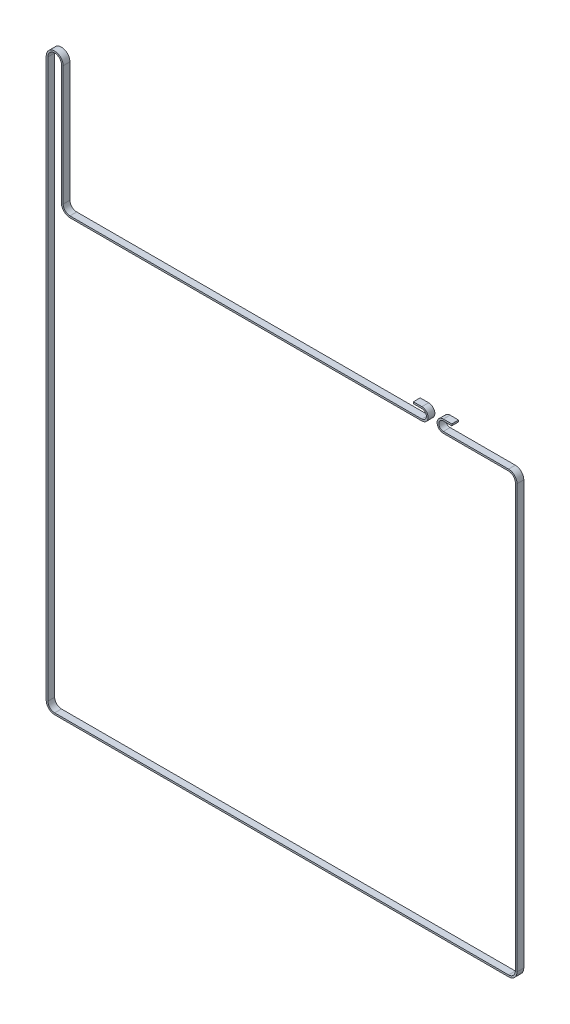
ISO-10303-21;
HEADER;
FILE_DESCRIPTION(('STEP AP214'),'2;1');
FILE_NAME('part.step','',(''),(''),'','','');
FILE_SCHEMA(('AUTOMOTIVE_DESIGN { 1 0 10303 214 1 1 1 1 }'));
ENDSEC;
DATA;
#1=APPLICATION_CONTEXT('core data for automotive mechanical design processes');
#2=APPLICATION_PROTOCOL_DEFINITION('international standard','automotive_design',2000,#1);
#3=PRODUCT_CONTEXT('',#1,'mechanical');
#4=PRODUCT('Part','Part','',(#3));
#5=PRODUCT_RELATED_PRODUCT_CATEGORY('part','',(#4));
#6=PRODUCT_DEFINITION_FORMATION('','',#4);
#7=PRODUCT_DEFINITION_CONTEXT('part definition',#1,'design');
#8=PRODUCT_DEFINITION('design','',#6,#7);
#9=PRODUCT_DEFINITION_SHAPE('','',#8);
#10=(LENGTH_UNIT() NAMED_UNIT(*) SI_UNIT(.MILLI.,.METRE.));
#11=(NAMED_UNIT(*) PLANE_ANGLE_UNIT() SI_UNIT($,.RADIAN.));
#12=(NAMED_UNIT(*) SI_UNIT($,.STERADIAN.) SOLID_ANGLE_UNIT());
#13=UNCERTAINTY_MEASURE_WITH_UNIT(LENGTH_MEASURE(1.E-05),#10,'distance_accuracy_value','');
#14=(GEOMETRIC_REPRESENTATION_CONTEXT(3) GLOBAL_UNCERTAINTY_ASSIGNED_CONTEXT((#13)) GLOBAL_UNIT_ASSIGNED_CONTEXT((#10,
#11,#12)) REPRESENTATION_CONTEXT('',''));
#15=CARTESIAN_POINT('',(0.,0.,0.));
#16=DIRECTION('',(0.,0.,1.));
#17=DIRECTION('',(1.,0.,0.));
#18=AXIS2_PLACEMENT_3D('',#15,#16,#17);
#19=CARTESIAN_POINT('',(317.727783268106,-102.649819195851,6.));
#20=DIRECTION('',(0.,-1.,0.));
#21=DIRECTION('',(1.,0.,0.));
#22=AXIS2_PLACEMENT_3D('',#19,#20,#21);
#23=PLANE('',#22);
#24=DIRECTION('',(-1.,0.,0.));
#25=VECTOR('',#24,1.);
#26=CARTESIAN_POINT('',(317.727783268106,-102.649819195851,0.));
#27=LINE('',#26,#25);
#28=CARTESIAN_POINT('',(325.227783268106,-102.649819195851,0.));
#29=VERTEX_POINT('',#28);
#30=CARTESIAN_POINT('',(317.727783268106,-102.649819195851,0.));
#31=VERTEX_POINT('',#30);
#32=EDGE_CURVE('E285',#29,#31,#27,.T.);
#33=ORIENTED_EDGE('',*,*,#32,.T.);
#34=DIRECTION('',(0.,0.,-1.));
#35=VECTOR('',#34,1.);
#36=CARTESIAN_POINT('',(317.727783268106,-102.649819195851,6.));
#37=LINE('',#36,#35);
#38=CARTESIAN_POINT('',(317.727783268106,-102.649819195851,6.));
#39=VERTEX_POINT('',#38);
#40=EDGE_CURVE('E13',#39,#31,#37,.T.);
#41=ORIENTED_EDGE('',*,*,#40,.F.);
#42=DIRECTION('',(-1.,0.,0.));
#43=VECTOR('',#42,1.);
#44=CARTESIAN_POINT('',(317.727783268106,-102.649819195851,6.));
#45=LINE('',#44,#43);
#46=CARTESIAN_POINT('',(325.227783268106,-102.649819195851,6.));
#47=VERTEX_POINT('',#46);
#48=EDGE_CURVE('E347',#47,#39,#45,.T.);
#49=ORIENTED_EDGE('',*,*,#48,.F.);
#50=DIRECTION('',(0.,0.,-1.));
#51=VECTOR('',#50,1.);
#52=CARTESIAN_POINT('',(325.227783268106,-102.649819195851,6.));
#53=LINE('',#52,#51);
#54=EDGE_CURVE('E281',#47,#29,#53,.T.);
#55=ORIENTED_EDGE('',*,*,#54,.T.);
#56=EDGE_LOOP('',(#33,#41,#49,#55));
#57=FACE_BOUND('',#56,.T.);
#58=ADVANCED_FACE('F45',(#57),#23,.F.);
#59=CARTESIAN_POINT('',(317.727783268106,-102.649819195851,6.));
#60=DIRECTION('',(1.,0.,0.));
#61=DIRECTION('',(0.,1.,0.));
#62=AXIS2_PLACEMENT_3D('',#59,#60,#61);
#63=PLANE('',#62);
#64=DIRECTION('',(0.,-1.,0.));
#65=VECTOR('',#64,1.);
#66=CARTESIAN_POINT('',(317.727783268106,-102.649819195851,0.));
#67=LINE('',#66,#65);
#68=CARTESIAN_POINT('',(317.727783268106,-104.149819195851,0.));
#69=VERTEX_POINT('',#68);
#70=EDGE_CURVE('E288',#31,#69,#67,.T.);
#71=ORIENTED_EDGE('',*,*,#70,.T.);
#72=DIRECTION('',(0.,0.,-1.));
#73=VECTOR('',#72,1.);
#74=CARTESIAN_POINT('',(317.727783268106,-104.149819195851,6.));
#75=LINE('',#74,#73);
#76=CARTESIAN_POINT('',(317.727783268106,-104.149819195851,6.));
#77=VERTEX_POINT('',#76);
#78=EDGE_CURVE('E53',#77,#69,#75,.T.);
#79=ORIENTED_EDGE('',*,*,#78,.F.);
#80=DIRECTION('',(0.,-1.,0.));
#81=VECTOR('',#80,1.);
#82=CARTESIAN_POINT('',(317.727783268106,-102.649819195851,6.));
#83=LINE('',#82,#81);
#84=EDGE_CURVE('E176',#39,#77,#83,.T.);
#85=ORIENTED_EDGE('',*,*,#84,.F.);
#86=ORIENTED_EDGE('',*,*,#40,.T.);
#87=EDGE_LOOP('',(#71,#79,#85,#86));
#88=FACE_BOUND('',#87,.T.);
#89=ADVANCED_FACE('F525',(#88),#63,.F.);
#90=CARTESIAN_POINT('',(317.727783268106,-104.149819195851,6.));
#91=DIRECTION('',(0.,1.,0.));
#92=DIRECTION('',(-1.,0.,0.));
#93=AXIS2_PLACEMENT_3D('',#90,#91,#92);
#94=PLANE('',#93);
#95=DIRECTION('',(1.,0.,0.));
#96=VECTOR('',#95,1.);
#97=CARTESIAN_POINT('',(317.727783268106,-104.149819195851,0.));
#98=LINE('',#97,#96);
#99=CARTESIAN_POINT('',(325.227783268106,-104.149819195851,0.));
#100=VERTEX_POINT('',#99);
#101=EDGE_CURVE('E290',#69,#100,#98,.T.);
#102=ORIENTED_EDGE('',*,*,#101,.T.);
#103=DIRECTION('',(0.,0.,-1.));
#104=VECTOR('',#103,1.);
#105=CARTESIAN_POINT('',(325.227783268106,-104.149819195851,6.));
#106=LINE('',#105,#104);
#107=CARTESIAN_POINT('',(325.227783268106,-104.149819195851,6.));
#108=VERTEX_POINT('',#107);
#109=EDGE_CURVE('E426',#108,#100,#106,.T.);
#110=ORIENTED_EDGE('',*,*,#109,.F.);
#111=DIRECTION('',(1.,0.,0.));
#112=VECTOR('',#111,1.);
#113=CARTESIAN_POINT('',(317.727783268106,-104.149819195851,6.));
#114=LINE('',#113,#112);
#115=EDGE_CURVE('E434',#77,#108,#114,.T.);
#116=ORIENTED_EDGE('',*,*,#115,.F.);
#117=ORIENTED_EDGE('',*,*,#78,.T.);
#118=EDGE_LOOP('',(#102,#110,#116,#117));
#119=FACE_BOUND('',#118,.T.);
#120=ADVANCED_FACE('F432',(#119),#94,.F.);
#121=CARTESIAN_POINT('',(325.227783268106,-108.14981919585,6.));
#122=DIRECTION('',(0.,0.,-1.));
#123=DIRECTION('',(-1.,0.,0.));
#124=AXIS2_PLACEMENT_3D('',#121,#122,#123);
#125=CYLINDRICAL_SURFACE('',#124,3.99999999999925);
#126=CARTESIAN_POINT('',(325.227783268106,-108.14981919585,0.));
#127=DIRECTION('',(0.,0.,-1.));
#128=DIRECTION('',(-1.,0.,0.));
#129=AXIS2_PLACEMENT_3D('',#126,#127,#128);
#130=CIRCLE('',#129,3.99999999999925);
#131=CARTESIAN_POINT('',(325.227783268106,-112.149819195849,0.));
#132=VERTEX_POINT('',#131);
#133=EDGE_CURVE('E292',#100,#132,#130,.T.);
#134=ORIENTED_EDGE('',*,*,#133,.T.);
#135=DIRECTION('',(0.,0.,-1.));
#136=VECTOR('',#135,1.);
#137=CARTESIAN_POINT('',(325.227783268106,-112.149819195849,6.));
#138=LINE('',#137,#136);
#139=CARTESIAN_POINT('',(325.227783268106,-112.149819195849,6.));
#140=VERTEX_POINT('',#139);
#141=EDGE_CURVE('E423',#140,#132,#138,.T.);
#142=ORIENTED_EDGE('',*,*,#141,.F.);
#143=CARTESIAN_POINT('',(325.227783268106,-108.14981919585,6.));
#144=DIRECTION('',(0.,0.,-1.));
#145=DIRECTION('',(-1.,0.,0.));
#146=AXIS2_PLACEMENT_3D('',#143,#144,#145);
#147=CIRCLE('',#146,3.99999999999925);
#148=EDGE_CURVE('E452',#108,#140,#147,.T.);
#149=ORIENTED_EDGE('',*,*,#148,.F.);
#150=ORIENTED_EDGE('',*,*,#109,.T.);
#151=EDGE_LOOP('',(#134,#142,#149,#150));
#152=FACE_BOUND('',#151,.T.);
#153=ADVANCED_FACE('F443',(#152),#125,.F.);
#154=CARTESIAN_POINT('',(13.4999999999877,-112.149819195849,6.));
#155=DIRECTION('',(0.,-1.,0.));
#156=DIRECTION('',(1.,0.,0.));
#157=AXIS2_PLACEMENT_3D('',#154,#155,#156);
#158=PLANE('',#157);
#159=DIRECTION('',(-1.,0.,0.));
#160=VECTOR('',#159,1.);
#161=CARTESIAN_POINT('',(13.4999999999877,-112.149819195849,0.));
#162=LINE('',#161,#160);
#163=CARTESIAN_POINT('',(13.4999999999877,-112.149819195849,0.));
#164=VERTEX_POINT('',#163);
#165=EDGE_CURVE('E294',#132,#164,#162,.T.);
#166=ORIENTED_EDGE('',*,*,#165,.T.);
#167=DIRECTION('',(0.,0.,-1.));
#168=VECTOR('',#167,1.);
#169=CARTESIAN_POINT('',(13.4999999999877,-112.149819195849,6.));
#170=LINE('',#169,#168);
#171=CARTESIAN_POINT('',(13.4999999999877,-112.149819195849,6.));
#172=VERTEX_POINT('',#171);
#173=EDGE_CURVE('E420',#172,#164,#170,.T.);
#174=ORIENTED_EDGE('',*,*,#173,.F.);
#175=DIRECTION('',(-1.,0.,0.));
#176=VECTOR('',#175,1.);
#177=CARTESIAN_POINT('',(13.4999999999877,-112.149819195849,6.));
#178=LINE('',#177,#176);
#179=EDGE_CURVE('E449',#140,#172,#178,.T.);
#180=ORIENTED_EDGE('',*,*,#179,.F.);
#181=ORIENTED_EDGE('',*,*,#141,.T.);
#182=EDGE_LOOP('',(#166,#174,#180,#181));
#183=FACE_BOUND('',#182,.T.);
#184=ADVANCED_FACE('F447',(#183),#158,.F.);
#185=CARTESIAN_POINT('',(13.4999999999877,-106.149819195849,6.));
#186=DIRECTION('',(0.,0.,-1.));
#187=DIRECTION('',(-1.,0.,0.));
#188=AXIS2_PLACEMENT_3D('',#185,#186,#187);
#189=CYLINDRICAL_SURFACE('',#188,6.);
#190=CARTESIAN_POINT('',(13.4999999999877,-106.149819195849,0.));
#191=DIRECTION('',(0.,0.,-1.));
#192=DIRECTION('',(1.,0.,0.));
#193=AXIS2_PLACEMENT_3D('',#190,#191,#192);
#194=CIRCLE('',#193,6.);
#195=CARTESIAN_POINT('',(7.49999999998772,-106.14981919585,0.));
#196=VERTEX_POINT('',#195);
#197=EDGE_CURVE('E296',#164,#196,#194,.T.);
#198=ORIENTED_EDGE('',*,*,#197,.T.);
#199=DIRECTION('',(0.,0.,-1.));
#200=VECTOR('',#199,1.);
#201=CARTESIAN_POINT('',(7.49999999998772,-106.14981919585,6.));
#202=LINE('',#201,#200);
#203=CARTESIAN_POINT('',(7.49999999998772,-106.14981919585,6.));
#204=VERTEX_POINT('',#203);
#205=EDGE_CURVE('E417',#204,#196,#202,.T.);
#206=ORIENTED_EDGE('',*,*,#205,.F.);
#207=CARTESIAN_POINT('',(13.4999999999877,-106.149819195849,6.));
#208=DIRECTION('',(0.,0.,-1.));
#209=DIRECTION('',(1.,0.,0.));
#210=AXIS2_PLACEMENT_3D('',#207,#208,#209);
#211=CIRCLE('',#210,6.);
#212=EDGE_CURVE('E451',#172,#204,#211,.T.);
#213=ORIENTED_EDGE('',*,*,#212,.F.);
#214=ORIENTED_EDGE('',*,*,#173,.T.);
#215=EDGE_LOOP('',(#198,#206,#213,#214));
#216=FACE_BOUND('',#215,.T.);
#217=ADVANCED_FACE('F538',(#216),#189,.F.);
#218=CARTESIAN_POINT('',(7.49999999997407,7.72076846855246E-13,6.));
#219=DIRECTION('',(-1.,-1.28637768246761E-13,0.));
#220=DIRECTION('',(1.28637768246761E-13,-1.,0.));
#221=AXIS2_PLACEMENT_3D('',#218,#219,#220);
#222=PLANE('',#221);
#223=DIRECTION('',(-1.28637768246761E-13,1.,0.));
#224=VECTOR('',#223,1.);
#225=CARTESIAN_POINT('',(7.49999999997407,7.72076846855246E-13,0.));
#226=LINE('',#225,#224);
#227=CARTESIAN_POINT('',(7.49999999997407,7.72076846855246E-13,0.));
#228=VERTEX_POINT('',#227);
#229=EDGE_CURVE('E298',#196,#228,#226,.T.);
#230=ORIENTED_EDGE('',*,*,#229,.T.);
#231=DIRECTION('',(0.,0.,-1.));
#232=VECTOR('',#231,1.);
#233=CARTESIAN_POINT('',(7.49999999997407,7.72076846855246E-13,6.));
#234=LINE('',#233,#232);
#235=CARTESIAN_POINT('',(7.49999999997407,7.72076846855246E-13,6.));
#236=VERTEX_POINT('',#235);
#237=EDGE_CURVE('E414',#236,#228,#234,.T.);
#238=ORIENTED_EDGE('',*,*,#237,.F.);
#239=DIRECTION('',(-1.28637768246761E-13,1.,0.));
#240=VECTOR('',#239,1.);
#241=CARTESIAN_POINT('',(7.49999999997407,7.72076846855246E-13,6.));
#242=LINE('',#241,#240);
#243=EDGE_CURVE('E454',#204,#236,#242,.T.);
#244=ORIENTED_EDGE('',*,*,#243,.F.);
#245=ORIENTED_EDGE('',*,*,#205,.T.);
#246=EDGE_LOOP('',(#230,#238,#244,#245));
#247=FACE_BOUND('',#246,.T.);
#248=ADVANCED_FACE('F541',(#247),#222,.F.);
#249=CARTESIAN_POINT('',(0.,0.,6.));
#250=DIRECTION('',(0.,0.,-1.));
#251=DIRECTION('',(-1.,0.,0.));
#252=AXIS2_PLACEMENT_3D('',#249,#250,#251);
#253=CYLINDRICAL_SURFACE('',#252,7.49999999997408);
#254=CARTESIAN_POINT('',(0.,0.,0.));
#255=DIRECTION('',(0.,0.,1.));
#256=DIRECTION('',(1.,0.,0.));
#257=AXIS2_PLACEMENT_3D('',#254,#255,#256);
#258=CIRCLE('',#257,7.49999999997408);
#259=CARTESIAN_POINT('',(-7.49999999997408,0.,0.));
#260=VERTEX_POINT('',#259);
#261=EDGE_CURVE('E300',#228,#260,#258,.T.);
#262=ORIENTED_EDGE('',*,*,#261,.T.);
#263=DIRECTION('',(0.,0.,-1.));
#264=VECTOR('',#263,1.);
#265=CARTESIAN_POINT('',(-7.49999999997408,0.,6.));
#266=LINE('',#265,#264);
#267=CARTESIAN_POINT('',(-7.49999999997408,0.,6.));
#268=VERTEX_POINT('',#267);
#269=EDGE_CURVE('E411',#268,#260,#266,.T.);
#270=ORIENTED_EDGE('',*,*,#269,.F.);
#271=CARTESIAN_POINT('',(0.,0.,6.));
#272=DIRECTION('',(0.,0.,1.));
#273=DIRECTION('',(1.,0.,0.));
#274=AXIS2_PLACEMENT_3D('',#271,#272,#273);
#275=CIRCLE('',#274,7.49999999997408);
#276=EDGE_CURVE('E460',#236,#268,#275,.T.);
#277=ORIENTED_EDGE('',*,*,#276,.F.);
#278=ORIENTED_EDGE('',*,*,#237,.T.);
#279=EDGE_LOOP('',(#262,#270,#277,#278));
#280=FACE_BOUND('',#279,.T.);
#281=ADVANCED_FACE('F545',(#280),#253,.T.);
#282=CARTESIAN_POINT('',(-7.49999999997409,0.,6.));
#283=DIRECTION('',(1.,0.,0.));
#284=DIRECTION('',(0.,1.,0.));
#285=AXIS2_PLACEMENT_3D('',#282,#283,#284);
#286=PLANE('',#285);
#287=DIRECTION('',(0.,-1.,0.));
#288=VECTOR('',#287,1.);
#289=CARTESIAN_POINT('',(-7.49999999997409,0.,0.));
#290=LINE('',#289,#288);
#291=CARTESIAN_POINT('',(-7.49999999997403,-494.149999999999,0.));
#292=VERTEX_POINT('',#291);
#293=EDGE_CURVE('E302',#260,#292,#290,.T.);
#294=ORIENTED_EDGE('',*,*,#293,.T.);
#295=DIRECTION('',(0.,0.,-1.));
#296=VECTOR('',#295,1.);
#297=CARTESIAN_POINT('',(-7.49999999997403,-494.149999999999,6.));
#298=LINE('',#297,#296);
#299=CARTESIAN_POINT('',(-7.49999999997403,-494.149999999999,6.));
#300=VERTEX_POINT('',#299);
#301=EDGE_CURVE('E408',#300,#292,#298,.T.);
#302=ORIENTED_EDGE('',*,*,#301,.F.);
#303=DIRECTION('',(0.,-1.,0.));
#304=VECTOR('',#303,1.);
#305=CARTESIAN_POINT('',(-7.49999999997409,0.,6.));
#306=LINE('',#305,#304);
#307=EDGE_CURVE('E462',#268,#300,#306,.T.);
#308=ORIENTED_EDGE('',*,*,#307,.F.);
#309=ORIENTED_EDGE('',*,*,#269,.T.);
#310=EDGE_LOOP('',(#294,#302,#308,#309));
#311=FACE_BOUND('',#310,.T.);
#312=ADVANCED_FACE('F549',(#311),#286,.F.);
#313=CARTESIAN_POINT('',(4.16175564765313E-12,-494.149999999999,6.));
#314=DIRECTION('',(0.,0.,-1.));
#315=DIRECTION('',(-1.,0.,0.));
#316=AXIS2_PLACEMENT_3D('',#313,#314,#315);
#317=CYLINDRICAL_SURFACE('',#316,7.49999999997819);
#318=CARTESIAN_POINT('',(4.16175564765313E-12,-494.149999999999,0.));
#319=DIRECTION('',(0.,0.,1.));
#320=DIRECTION('',(1.,0.,0.));
#321=AXIS2_PLACEMENT_3D('',#318,#319,#320);
#322=CIRCLE('',#321,7.49999999997819);
#323=CARTESIAN_POINT('',(4.16037792000409E-12,-501.649999999978,0.));
#324=VERTEX_POINT('',#323);
#325=EDGE_CURVE('E304',#292,#324,#322,.T.);
#326=ORIENTED_EDGE('',*,*,#325,.T.);
#327=DIRECTION('',(0.,0.,-1.));
#328=VECTOR('',#327,1.);
#329=CARTESIAN_POINT('',(4.16037792000409E-12,-501.649999999978,6.));
#330=LINE('',#329,#328);
#331=CARTESIAN_POINT('',(4.16037792000409E-12,-501.649999999978,6.));
#332=VERTEX_POINT('',#331);
#333=EDGE_CURVE('E405',#332,#324,#330,.T.);
#334=ORIENTED_EDGE('',*,*,#333,.F.);
#335=CARTESIAN_POINT('',(4.16175564765313E-12,-494.149999999999,6.));
#336=DIRECTION('',(0.,0.,1.));
#337=DIRECTION('',(1.,0.,0.));
#338=AXIS2_PLACEMENT_3D('',#335,#336,#337);
#339=CIRCLE('',#338,7.49999999997819);
#340=EDGE_CURVE('E464',#300,#332,#339,.T.);
#341=ORIENTED_EDGE('',*,*,#340,.F.);
#342=ORIENTED_EDGE('',*,*,#301,.T.);
#343=EDGE_LOOP('',(#326,#334,#341,#342));
#344=FACE_BOUND('',#343,.T.);
#345=ADVANCED_FACE('F553',(#344),#317,.T.);
#346=CARTESIAN_POINT('',(4.16175564765313E-12,-501.649999999978,6.));
#347=DIRECTION('',(0.,1.,0.));
#348=DIRECTION('',(0.,0.,1.));
#349=AXIS2_PLACEMENT_3D('',#346,#347,#348);
#350=PLANE('',#349);
#351=DIRECTION('',(1.,0.,0.));
#352=VECTOR('',#351,1.);
#353=CARTESIAN_POINT('',(4.16175564765313E-12,-501.649999999978,0.));
#354=LINE('',#353,#352);
#355=CARTESIAN_POINT('',(401.999999999992,-501.649999999978,0.));
#356=VERTEX_POINT('',#355);
#357=EDGE_CURVE('E306',#324,#356,#354,.T.);
#358=ORIENTED_EDGE('',*,*,#357,.T.);
#359=DIRECTION('',(0.,0.,-1.));
#360=VECTOR('',#359,1.);
#361=CARTESIAN_POINT('',(401.999999999992,-501.649999999978,6.));
#362=LINE('',#361,#360);
#363=CARTESIAN_POINT('',(401.999999999992,-501.649999999978,6.));
#364=VERTEX_POINT('',#363);
#365=EDGE_CURVE('E402',#364,#356,#362,.T.);
#366=ORIENTED_EDGE('',*,*,#365,.F.);
#367=DIRECTION('',(1.,0.,0.));
#368=VECTOR('',#367,1.);
#369=CARTESIAN_POINT('',(4.16175564765313E-12,-501.649999999978,6.));
#370=LINE('',#369,#368);
#371=EDGE_CURVE('E466',#332,#364,#370,.T.);
#372=ORIENTED_EDGE('',*,*,#371,.F.);
#373=ORIENTED_EDGE('',*,*,#333,.T.);
#374=EDGE_LOOP('',(#358,#366,#372,#373));
#375=FACE_BOUND('',#374,.T.);
#376=ADVANCED_FACE('F557',(#375),#350,.F.);
#377=CARTESIAN_POINT('',(401.999999999992,-494.150000000003,6.));
#378=DIRECTION('',(0.,0.,-1.));
#379=DIRECTION('',(-1.,0.,0.));
#380=AXIS2_PLACEMENT_3D('',#377,#378,#379);
#381=CYLINDRICAL_SURFACE('',#380,7.49999999997447);
#382=CARTESIAN_POINT('',(401.999999999992,-494.150000000003,0.));
#383=DIRECTION('',(0.,0.,1.));
#384=DIRECTION('',(1.,0.,0.));
#385=AXIS2_PLACEMENT_3D('',#382,#383,#384);
#386=CIRCLE('',#385,7.49999999997447);
#387=CARTESIAN_POINT('',(409.499999999967,-494.150000000003,0.));
#388=VERTEX_POINT('',#387);
#389=EDGE_CURVE('E308',#356,#388,#386,.T.);
#390=ORIENTED_EDGE('',*,*,#389,.T.);
#391=DIRECTION('',(0.,0.,-1.));
#392=VECTOR('',#391,1.);
#393=CARTESIAN_POINT('',(409.499999999967,-494.150000000003,6.));
#394=LINE('',#393,#392);
#395=CARTESIAN_POINT('',(409.499999999967,-494.150000000003,6.));
#396=VERTEX_POINT('',#395);
#397=EDGE_CURVE('E399',#396,#388,#394,.T.);
#398=ORIENTED_EDGE('',*,*,#397,.F.);
#399=CARTESIAN_POINT('',(401.999999999992,-494.150000000003,6.));
#400=DIRECTION('',(0.,0.,1.));
#401=DIRECTION('',(1.,0.,0.));
#402=AXIS2_PLACEMENT_3D('',#399,#400,#401);
#403=CIRCLE('',#402,7.49999999997447);
#404=EDGE_CURVE('E468',#364,#396,#403,.T.);
#405=ORIENTED_EDGE('',*,*,#404,.F.);
#406=ORIENTED_EDGE('',*,*,#365,.T.);
#407=EDGE_LOOP('',(#390,#398,#405,#406));
#408=FACE_BOUND('',#407,.T.);
#409=ADVANCED_FACE('F561',(#408),#381,.T.);
#410=CARTESIAN_POINT('',(409.499999999967,-494.150000000003,6.));
#411=DIRECTION('',(-1.,0.,0.));
#412=DIRECTION('',(0.,-1.,0.));
#413=AXIS2_PLACEMENT_3D('',#410,#411,#412);
#414=PLANE('',#413);
#415=DIRECTION('',(0.,1.,0.));
#416=VECTOR('',#415,1.);
#417=CARTESIAN_POINT('',(409.499999999967,-494.150000000003,0.));
#418=LINE('',#417,#416);
#419=CARTESIAN_POINT('',(409.499999999967,-119.649819195821,0.));
#420=VERTEX_POINT('',#419);
#421=EDGE_CURVE('E310',#388,#420,#418,.T.);
#422=ORIENTED_EDGE('',*,*,#421,.T.);
#423=DIRECTION('',(0.,0.,-1.));
#424=VECTOR('',#423,1.);
#425=CARTESIAN_POINT('',(409.499999999967,-119.649819195821,6.));
#426=LINE('',#425,#424);
#427=CARTESIAN_POINT('',(409.499999999967,-119.649819195821,6.));
#428=VERTEX_POINT('',#427);
#429=EDGE_CURVE('E396',#428,#420,#426,.T.);
#430=ORIENTED_EDGE('',*,*,#429,.F.);
#431=DIRECTION('',(0.,1.,0.));
#432=VECTOR('',#431,1.);
#433=CARTESIAN_POINT('',(409.499999999967,-494.150000000003,6.));
#434=LINE('',#433,#432);
#435=EDGE_CURVE('E470',#396,#428,#434,.T.);
#436=ORIENTED_EDGE('',*,*,#435,.F.);
#437=ORIENTED_EDGE('',*,*,#397,.T.);
#438=EDGE_LOOP('',(#422,#430,#436,#437));
#439=FACE_BOUND('',#438,.T.);
#440=ADVANCED_FACE('F565',(#439),#414,.F.);
#441=CARTESIAN_POINT('',(401.999999999967,-119.649819195821,6.));
#442=DIRECTION('',(0.,0.,-1.));
#443=DIRECTION('',(-1.,0.,0.));
#444=AXIS2_PLACEMENT_3D('',#441,#442,#443);
#445=CYLINDRICAL_SURFACE('',#444,7.49999999999954);
#446=CARTESIAN_POINT('',(401.999999999967,-119.649819195821,0.));
#447=DIRECTION('',(0.,0.,1.));
#448=DIRECTION('',(1.,0.,0.));
#449=AXIS2_PLACEMENT_3D('',#446,#447,#448);
#450=CIRCLE('',#449,7.49999999999954);
#451=CARTESIAN_POINT('',(401.999999999967,-112.149819195821,0.));
#452=VERTEX_POINT('',#451);
#453=EDGE_CURVE('E312',#420,#452,#450,.T.);
#454=ORIENTED_EDGE('',*,*,#453,.T.);
#455=DIRECTION('',(0.,0.,-1.));
#456=VECTOR('',#455,1.);
#457=CARTESIAN_POINT('',(401.999999999967,-112.149819195821,6.));
#458=LINE('',#457,#456);
#459=CARTESIAN_POINT('',(401.999999999967,-112.149819195821,6.));
#460=VERTEX_POINT('',#459);
#461=EDGE_CURVE('E393',#460,#452,#458,.T.);
#462=ORIENTED_EDGE('',*,*,#461,.F.);
#463=CARTESIAN_POINT('',(401.999999999967,-119.649819195821,6.));
#464=DIRECTION('',(0.,0.,1.));
#465=DIRECTION('',(1.,0.,0.));
#466=AXIS2_PLACEMENT_3D('',#463,#464,#465);
#467=CIRCLE('',#466,7.49999999999954);
#468=EDGE_CURVE('E472',#428,#460,#467,.T.);
#469=ORIENTED_EDGE('',*,*,#468,.F.);
#470=ORIENTED_EDGE('',*,*,#429,.T.);
#471=EDGE_LOOP('',(#454,#462,#469,#470));
#472=FACE_BOUND('',#471,.T.);
#473=ADVANCED_FACE('F569',(#472),#445,.T.);
#474=CARTESIAN_POINT('',(401.999999999967,-112.149819195821,6.));
#475=DIRECTION('',(0.,-1.,0.));
#476=DIRECTION('',(1.,0.,0.));
#477=AXIS2_PLACEMENT_3D('',#474,#475,#476);
#478=PLANE('',#477);
#479=DIRECTION('',(-1.,0.,0.));
#480=VECTOR('',#479,1.);
#481=CARTESIAN_POINT('',(401.999999999967,-112.149819195821,0.));
#482=LINE('',#481,#480);
#483=CARTESIAN_POINT('',(344.227783268107,-112.149819195821,0.));
#484=VERTEX_POINT('',#483);
#485=EDGE_CURVE('E314',#452,#484,#482,.T.);
#486=ORIENTED_EDGE('',*,*,#485,.T.);
#487=DIRECTION('',(0.,0.,-1.));
#488=VECTOR('',#487,1.);
#489=CARTESIAN_POINT('',(344.227783268107,-112.149819195821,6.));
#490=LINE('',#489,#488);
#491=CARTESIAN_POINT('',(344.227783268107,-112.149819195821,6.));
#492=VERTEX_POINT('',#491);
#493=EDGE_CURVE('E390',#492,#484,#490,.T.);
#494=ORIENTED_EDGE('',*,*,#493,.F.);
#495=DIRECTION('',(-1.,0.,0.));
#496=VECTOR('',#495,1.);
#497=CARTESIAN_POINT('',(401.999999999967,-112.149819195821,6.));
#498=LINE('',#497,#496);
#499=EDGE_CURVE('E474',#460,#492,#498,.T.);
#500=ORIENTED_EDGE('',*,*,#499,.F.);
#501=ORIENTED_EDGE('',*,*,#461,.T.);
#502=EDGE_LOOP('',(#486,#494,#500,#501));
#503=FACE_BOUND('',#502,.T.);
#504=ADVANCED_FACE('F573',(#503),#478,.F.);
#505=CARTESIAN_POINT('',(344.227783268107,-108.149819195822,6.));
#506=DIRECTION('',(0.,0.,-1.));
#507=DIRECTION('',(-1.,0.,0.));
#508=AXIS2_PLACEMENT_3D('',#505,#506,#507);
#509=CYLINDRICAL_SURFACE('',#508,3.99999999999949);
#510=CARTESIAN_POINT('',(344.227783268107,-108.149819195822,0.));
#511=DIRECTION('',(0.,0.,-1.));
#512=DIRECTION('',(1.,0.,0.));
#513=AXIS2_PLACEMENT_3D('',#510,#511,#512);
#514=CIRCLE('',#513,3.99999999999949);
#515=CARTESIAN_POINT('',(344.227783268107,-104.149819195822,0.));
#516=VERTEX_POINT('',#515);
#517=EDGE_CURVE('E316',#484,#516,#514,.T.);
#518=ORIENTED_EDGE('',*,*,#517,.T.);
#519=DIRECTION('',(0.,0.,-1.));
#520=VECTOR('',#519,1.);
#521=CARTESIAN_POINT('',(344.227783268107,-104.149819195822,6.));
#522=LINE('',#521,#520);
#523=CARTESIAN_POINT('',(344.227783268107,-104.149819195822,6.));
#524=VERTEX_POINT('',#523);
#525=EDGE_CURVE('E387',#524,#516,#522,.T.);
#526=ORIENTED_EDGE('',*,*,#525,.F.);
#527=CARTESIAN_POINT('',(344.227783268107,-108.149819195822,6.));
#528=DIRECTION('',(0.,0.,-1.));
#529=DIRECTION('',(1.,0.,0.));
#530=AXIS2_PLACEMENT_3D('',#527,#528,#529);
#531=CIRCLE('',#530,3.99999999999949);
#532=EDGE_CURVE('E476',#492,#524,#531,.T.);
#533=ORIENTED_EDGE('',*,*,#532,.F.);
#534=ORIENTED_EDGE('',*,*,#493,.T.);
#535=EDGE_LOOP('',(#518,#526,#533,#534));
#536=FACE_BOUND('',#535,.T.);
#537=ADVANCED_FACE('F577',(#536),#509,.F.);
#538=CARTESIAN_POINT('',(351.727783268107,-104.149819195822,6.));
#539=DIRECTION('',(0.,1.,0.));
#540=DIRECTION('',(-1.,0.,0.));
#541=AXIS2_PLACEMENT_3D('',#538,#539,#540);
#542=PLANE('',#541);
#543=DIRECTION('',(1.,0.,0.));
#544=VECTOR('',#543,1.);
#545=CARTESIAN_POINT('',(351.727783268107,-104.149819195822,0.));
#546=LINE('',#545,#544);
#547=CARTESIAN_POINT('',(351.727783268107,-104.149819195822,0.));
#548=VERTEX_POINT('',#547);
#549=EDGE_CURVE('E318',#516,#548,#546,.T.);
#550=ORIENTED_EDGE('',*,*,#549,.T.);
#551=DIRECTION('',(0.,0.,-1.));
#552=VECTOR('',#551,1.);
#553=CARTESIAN_POINT('',(351.727783268107,-104.149819195822,6.));
#554=LINE('',#553,#552);
#555=CARTESIAN_POINT('',(351.727783268107,-104.149819195822,6.));
#556=VERTEX_POINT('',#555);
#557=EDGE_CURVE('E384',#556,#548,#554,.T.);
#558=ORIENTED_EDGE('',*,*,#557,.F.);
#559=DIRECTION('',(1.,0.,0.));
#560=VECTOR('',#559,1.);
#561=CARTESIAN_POINT('',(351.727783268107,-104.149819195822,6.));
#562=LINE('',#561,#560);
#563=EDGE_CURVE('E478',#524,#556,#562,.T.);
#564=ORIENTED_EDGE('',*,*,#563,.F.);
#565=ORIENTED_EDGE('',*,*,#525,.T.);
#566=EDGE_LOOP('',(#550,#558,#564,#565));
#567=FACE_BOUND('',#566,.T.);
#568=ADVANCED_FACE('F581',(#567),#542,.F.);
#569=CARTESIAN_POINT('',(351.727783268107,-102.649819195823,6.));
#570=DIRECTION('',(-1.,0.,0.));
#571=DIRECTION('',(0.,0.,1.));
#572=AXIS2_PLACEMENT_3D('',#569,#570,#571);
#573=PLANE('',#572);
#574=DIRECTION('',(0.,1.,0.));
#575=VECTOR('',#574,1.);
#576=CARTESIAN_POINT('',(351.727783268107,-102.649819195823,0.));
#577=LINE('',#576,#575);
#578=CARTESIAN_POINT('',(351.727783268107,-102.649819195823,0.));
#579=VERTEX_POINT('',#578);
#580=EDGE_CURVE('E320',#548,#579,#577,.T.);
#581=ORIENTED_EDGE('',*,*,#580,.T.);
#582=DIRECTION('',(0.,0.,-1.));
#583=VECTOR('',#582,1.);
#584=CARTESIAN_POINT('',(351.727783268107,-102.649819195823,6.));
#585=LINE('',#584,#583);
#586=CARTESIAN_POINT('',(351.727783268107,-102.649819195823,6.));
#587=VERTEX_POINT('',#586);
#588=EDGE_CURVE('E381',#587,#579,#585,.T.);
#589=ORIENTED_EDGE('',*,*,#588,.F.);
#590=DIRECTION('',(0.,1.,0.));
#591=VECTOR('',#590,1.);
#592=CARTESIAN_POINT('',(351.727783268107,-102.649819195823,6.));
#593=LINE('',#592,#591);
#594=EDGE_CURVE('E480',#556,#587,#593,.T.);
#595=ORIENTED_EDGE('',*,*,#594,.F.);
#596=ORIENTED_EDGE('',*,*,#557,.T.);
#597=EDGE_LOOP('',(#581,#589,#595,#596));
#598=FACE_BOUND('',#597,.T.);
#599=ADVANCED_FACE('F585',(#598),#573,.F.);
#600=CARTESIAN_POINT('',(351.727783268107,-102.649819195823,6.));
#601=DIRECTION('',(0.,-1.,0.));
#602=DIRECTION('',(0.,0.,-1.));
#603=AXIS2_PLACEMENT_3D('',#600,#601,#602);
#604=PLANE('',#603);
#605=DIRECTION('',(-1.,0.,0.));
#606=VECTOR('',#605,1.);
#607=CARTESIAN_POINT('',(351.727783268107,-102.649819195823,0.));
#608=LINE('',#607,#606);
#609=CARTESIAN_POINT('',(344.227783268107,-102.649819195823,0.));
#610=VERTEX_POINT('',#609);
#611=EDGE_CURVE('E322',#579,#610,#608,.T.);
#612=ORIENTED_EDGE('',*,*,#611,.T.);
#613=DIRECTION('',(0.,0.,-1.));
#614=VECTOR('',#613,1.);
#615=CARTESIAN_POINT('',(344.227783268107,-102.649819195823,6.));
#616=LINE('',#615,#614);
#617=CARTESIAN_POINT('',(344.227783268107,-102.649819195823,6.));
#618=VERTEX_POINT('',#617);
#619=EDGE_CURVE('E378',#618,#610,#616,.T.);
#620=ORIENTED_EDGE('',*,*,#619,.F.);
#621=DIRECTION('',(-1.,0.,0.));
#622=VECTOR('',#621,1.);
#623=CARTESIAN_POINT('',(351.727783268107,-102.649819195823,6.));
#624=LINE('',#623,#622);
#625=EDGE_CURVE('E482',#587,#618,#624,.T.);
#626=ORIENTED_EDGE('',*,*,#625,.F.);
#627=ORIENTED_EDGE('',*,*,#588,.T.);
#628=EDGE_LOOP('',(#612,#620,#626,#627));
#629=FACE_BOUND('',#628,.T.);
#630=ADVANCED_FACE('F589',(#629),#604,.F.);
#631=CARTESIAN_POINT('',(344.227783268107,-108.149819195822,6.));
#632=DIRECTION('',(0.,0.,-1.));
#633=DIRECTION('',(-1.,0.,0.));
#634=AXIS2_PLACEMENT_3D('',#631,#632,#633);
#635=CYLINDRICAL_SURFACE('',#634,5.49999999999898);
#636=CARTESIAN_POINT('',(344.227783268107,-108.149819195822,0.));
#637=DIRECTION('',(0.,0.,1.));
#638=DIRECTION('',(1.,0.,0.));
#639=AXIS2_PLACEMENT_3D('',#636,#637,#638);
#640=CIRCLE('',#639,5.49999999999898);
#641=CARTESIAN_POINT('',(344.227783268107,-113.649819195821,0.));
#642=VERTEX_POINT('',#641);
#643=EDGE_CURVE('E324',#610,#642,#640,.T.);
#644=ORIENTED_EDGE('',*,*,#643,.T.);
#645=DIRECTION('',(0.,0.,-1.));
#646=VECTOR('',#645,1.);
#647=CARTESIAN_POINT('',(344.227783268107,-113.649819195821,6.));
#648=LINE('',#647,#646);
#649=CARTESIAN_POINT('',(344.227783268107,-113.649819195821,6.));
#650=VERTEX_POINT('',#649);
#651=EDGE_CURVE('E375',#650,#642,#648,.T.);
#652=ORIENTED_EDGE('',*,*,#651,.F.);
#653=CARTESIAN_POINT('',(344.227783268107,-108.149819195822,6.));
#654=DIRECTION('',(0.,0.,1.));
#655=DIRECTION('',(1.,0.,0.));
#656=AXIS2_PLACEMENT_3D('',#653,#654,#655);
#657=CIRCLE('',#656,5.49999999999898);
#658=EDGE_CURVE('E484',#618,#650,#657,.T.);
#659=ORIENTED_EDGE('',*,*,#658,.F.);
#660=ORIENTED_EDGE('',*,*,#619,.T.);
#661=EDGE_LOOP('',(#644,#652,#659,#660));
#662=FACE_BOUND('',#661,.T.);
#663=ADVANCED_FACE('F593',(#662),#635,.T.);
#664=CARTESIAN_POINT('',(401.999999999967,-113.649819195821,6.));
#665=DIRECTION('',(0.,1.,0.));
#666=DIRECTION('',(0.,0.,1.));
#667=AXIS2_PLACEMENT_3D('',#664,#665,#666);
#668=PLANE('',#667);
#669=DIRECTION('',(1.,0.,0.));
#670=VECTOR('',#669,1.);
#671=CARTESIAN_POINT('',(401.999999999967,-113.649819195821,0.));
#672=LINE('',#671,#670);
#673=CARTESIAN_POINT('',(401.999999999967,-113.649819195821,0.));
#674=VERTEX_POINT('',#673);
#675=EDGE_CURVE('E326',#642,#674,#672,.T.);
#676=ORIENTED_EDGE('',*,*,#675,.T.);
#677=DIRECTION('',(0.,0.,-1.));
#678=VECTOR('',#677,1.);
#679=CARTESIAN_POINT('',(401.999999999967,-113.649819195821,6.));
#680=LINE('',#679,#678);
#681=CARTESIAN_POINT('',(401.999999999967,-113.649819195821,6.));
#682=VERTEX_POINT('',#681);
#683=EDGE_CURVE('E372',#682,#674,#680,.T.);
#684=ORIENTED_EDGE('',*,*,#683,.F.);
#685=DIRECTION('',(1.,0.,0.));
#686=VECTOR('',#685,1.);
#687=CARTESIAN_POINT('',(401.999999999967,-113.649819195821,6.));
#688=LINE('',#687,#686);
#689=EDGE_CURVE('E486',#650,#682,#688,.T.);
#690=ORIENTED_EDGE('',*,*,#689,.F.);
#691=ORIENTED_EDGE('',*,*,#651,.T.);
#692=EDGE_LOOP('',(#676,#684,#690,#691));
#693=FACE_BOUND('',#692,.T.);
#694=ADVANCED_FACE('F597',(#693),#668,.F.);
#695=CARTESIAN_POINT('',(401.999999999967,-119.649819195821,6.));
#696=DIRECTION('',(0.,0.,-1.));
#697=DIRECTION('',(-1.,0.,0.));
#698=AXIS2_PLACEMENT_3D('',#695,#696,#697);
#699=CYLINDRICAL_SURFACE('',#698,6.00000000000001);
#700=CARTESIAN_POINT('',(401.999999999967,-119.649819195821,0.));
#701=DIRECTION('',(0.,0.,-1.));
#702=DIRECTION('',(1.,0.,0.));
#703=AXIS2_PLACEMENT_3D('',#700,#701,#702);
#704=CIRCLE('',#703,6.00000000000001);
#705=CARTESIAN_POINT('',(407.999999999967,-119.649819195821,0.));
#706=VERTEX_POINT('',#705);
#707=EDGE_CURVE('E328',#674,#706,#704,.T.);
#708=ORIENTED_EDGE('',*,*,#707,.T.);
#709=DIRECTION('',(0.,0.,-1.));
#710=VECTOR('',#709,1.);
#711=CARTESIAN_POINT('',(407.999999999967,-119.649819195821,6.));
#712=LINE('',#711,#710);
#713=CARTESIAN_POINT('',(407.999999999967,-119.649819195821,6.));
#714=VERTEX_POINT('',#713);
#715=EDGE_CURVE('E369',#714,#706,#712,.T.);
#716=ORIENTED_EDGE('',*,*,#715,.F.);
#717=CARTESIAN_POINT('',(401.999999999967,-119.649819195821,6.));
#718=DIRECTION('',(0.,0.,-1.));
#719=DIRECTION('',(1.,0.,0.));
#720=AXIS2_PLACEMENT_3D('',#717,#718,#719);
#721=CIRCLE('',#720,6.00000000000001);
#722=EDGE_CURVE('E488',#682,#714,#721,.T.);
#723=ORIENTED_EDGE('',*,*,#722,.F.);
#724=ORIENTED_EDGE('',*,*,#683,.T.);
#725=EDGE_LOOP('',(#708,#716,#723,#724));
#726=FACE_BOUND('',#725,.T.);
#727=ADVANCED_FACE('F601',(#726),#699,.F.);
#728=CARTESIAN_POINT('',(407.999999999967,-494.150000000003,6.));
#729=DIRECTION('',(1.,0.,0.));
#730=DIRECTION('',(0.,0.,-1.));
#731=AXIS2_PLACEMENT_3D('',#728,#729,#730);
#732=PLANE('',#731);
#733=DIRECTION('',(0.,-1.,0.));
#734=VECTOR('',#733,1.);
#735=CARTESIAN_POINT('',(407.999999999967,-494.150000000003,0.));
#736=LINE('',#735,#734);
#737=CARTESIAN_POINT('',(407.999999999967,-494.150000000003,0.));
#738=VERTEX_POINT('',#737);
#739=EDGE_CURVE('E330',#706,#738,#736,.T.);
#740=ORIENTED_EDGE('',*,*,#739,.T.);
#741=DIRECTION('',(0.,0.,-1.));
#742=VECTOR('',#741,1.);
#743=CARTESIAN_POINT('',(407.999999999967,-494.150000000003,6.));
#744=LINE('',#743,#742);
#745=CARTESIAN_POINT('',(407.999999999967,-494.150000000003,6.));
#746=VERTEX_POINT('',#745);
#747=EDGE_CURVE('E366',#746,#738,#744,.T.);
#748=ORIENTED_EDGE('',*,*,#747,.F.);
#749=DIRECTION('',(0.,-1.,0.));
#750=VECTOR('',#749,1.);
#751=CARTESIAN_POINT('',(407.999999999967,-494.150000000003,6.));
#752=LINE('',#751,#750);
#753=EDGE_CURVE('E490',#714,#746,#752,.T.);
#754=ORIENTED_EDGE('',*,*,#753,.F.);
#755=ORIENTED_EDGE('',*,*,#715,.T.);
#756=EDGE_LOOP('',(#740,#748,#754,#755));
#757=FACE_BOUND('',#756,.T.);
#758=ADVANCED_FACE('F605',(#757),#732,.F.);
#759=CARTESIAN_POINT('',(401.999999999992,-494.150000000003,6.));
#760=DIRECTION('',(0.,0.,-1.));
#761=DIRECTION('',(-1.,0.,0.));
#762=AXIS2_PLACEMENT_3D('',#759,#760,#761);
#763=CYLINDRICAL_SURFACE('',#762,5.99999999998563);
#764=CARTESIAN_POINT('',(401.999999999992,-494.150000000003,0.));
#765=DIRECTION('',(0.,0.,-1.));
#766=DIRECTION('',(1.,0.,0.));
#767=AXIS2_PLACEMENT_3D('',#764,#765,#766);
#768=CIRCLE('',#767,5.99999999998563);
#769=CARTESIAN_POINT('',(401.999999999992,-500.149999999989,0.));
#770=VERTEX_POINT('',#769);
#771=EDGE_CURVE('E332',#738,#770,#768,.T.);
#772=ORIENTED_EDGE('',*,*,#771,.T.);
#773=DIRECTION('',(0.,0.,-1.));
#774=VECTOR('',#773,1.);
#775=CARTESIAN_POINT('',(401.999999999992,-500.149999999989,6.));
#776=LINE('',#775,#774);
#777=CARTESIAN_POINT('',(401.999999999992,-500.149999999989,6.));
#778=VERTEX_POINT('',#777);
#779=EDGE_CURVE('E363',#778,#770,#776,.T.);
#780=ORIENTED_EDGE('',*,*,#779,.F.);
#781=CARTESIAN_POINT('',(401.999999999992,-494.150000000003,6.));
#782=DIRECTION('',(0.,0.,-1.));
#783=DIRECTION('',(1.,0.,0.));
#784=AXIS2_PLACEMENT_3D('',#781,#782,#783);
#785=CIRCLE('',#784,5.99999999998563);
#786=EDGE_CURVE('E492',#746,#778,#785,.T.);
#787=ORIENTED_EDGE('',*,*,#786,.F.);
#788=ORIENTED_EDGE('',*,*,#747,.T.);
#789=EDGE_LOOP('',(#772,#780,#787,#788));
#790=FACE_BOUND('',#789,.T.);
#791=ADVANCED_FACE('F609',(#790),#763,.F.);
#792=CARTESIAN_POINT('',(4.16175564765313E-12,-500.149999999999,6.));
#793=DIRECTION('',(0.,-1.,0.));
#794=DIRECTION('',(1.,0.,0.));
#795=AXIS2_PLACEMENT_3D('',#792,#793,#794);
#796=PLANE('',#795);
#797=DIRECTION('',(-1.,0.,0.));
#798=VECTOR('',#797,1.);
#799=CARTESIAN_POINT('',(4.16175564765313E-12,-500.149999999999,0.));
#800=LINE('',#799,#798);
#801=CARTESIAN_POINT('',(4.16175564765313E-12,-500.149999999999,0.));
#802=VERTEX_POINT('',#801);
#803=EDGE_CURVE('E334',#770,#802,#800,.T.);
#804=ORIENTED_EDGE('',*,*,#803,.T.);
#805=DIRECTION('',(0.,0.,-1.));
#806=VECTOR('',#805,1.);
#807=CARTESIAN_POINT('',(4.16175564765313E-12,-500.149999999999,6.));
#808=LINE('',#807,#806);
#809=CARTESIAN_POINT('',(4.16175564765313E-12,-500.149999999999,6.));
#810=VERTEX_POINT('',#809);
#811=EDGE_CURVE('E360',#810,#802,#808,.T.);
#812=ORIENTED_EDGE('',*,*,#811,.F.);
#813=DIRECTION('',(-1.,0.,0.));
#814=VECTOR('',#813,1.);
#815=CARTESIAN_POINT('',(4.16175564765313E-12,-500.149999999999,6.));
#816=LINE('',#815,#814);
#817=EDGE_CURVE('E494',#778,#810,#816,.T.);
#818=ORIENTED_EDGE('',*,*,#817,.F.);
#819=ORIENTED_EDGE('',*,*,#779,.T.);
#820=EDGE_LOOP('',(#804,#812,#818,#819));
#821=FACE_BOUND('',#820,.T.);
#822=ADVANCED_FACE('F613',(#821),#796,.F.);
#823=CARTESIAN_POINT('',(4.16175564765313E-12,-494.149999999999,6.));
#824=DIRECTION('',(0.,0.,-1.));
#825=DIRECTION('',(-1.,0.,0.));
#826=AXIS2_PLACEMENT_3D('',#823,#824,#825);
#827=CYLINDRICAL_SURFACE('',#826,6.000000000002);
#828=CARTESIAN_POINT('',(4.16175564765313E-12,-494.149999999999,0.));
#829=DIRECTION('',(0.,0.,-1.));
#830=DIRECTION('',(1.,0.,0.));
#831=AXIS2_PLACEMENT_3D('',#828,#829,#830);
#832=CIRCLE('',#831,6.000000000002);
#833=CARTESIAN_POINT('',(-5.99999999999784,-494.150000000002,0.));
#834=VERTEX_POINT('',#833);
#835=EDGE_CURVE('E336',#802,#834,#832,.T.);
#836=ORIENTED_EDGE('',*,*,#835,.T.);
#837=DIRECTION('',(0.,0.,-1.));
#838=VECTOR('',#837,1.);
#839=CARTESIAN_POINT('',(-5.99999999999784,-494.150000000002,6.));
#840=LINE('',#839,#838);
#841=CARTESIAN_POINT('',(-5.99999999999784,-494.150000000002,6.));
#842=VERTEX_POINT('',#841);
#843=EDGE_CURVE('E357',#842,#834,#840,.T.);
#844=ORIENTED_EDGE('',*,*,#843,.F.);
#845=CARTESIAN_POINT('',(4.16175564765313E-12,-494.149999999999,6.));
#846=DIRECTION('',(0.,0.,-1.));
#847=DIRECTION('',(1.,0.,0.));
#848=AXIS2_PLACEMENT_3D('',#845,#846,#847);
#849=CIRCLE('',#848,6.000000000002);
#850=EDGE_CURVE('E496',#810,#842,#849,.T.);
#851=ORIENTED_EDGE('',*,*,#850,.F.);
#852=ORIENTED_EDGE('',*,*,#811,.T.);
#853=EDGE_LOOP('',(#836,#844,#851,#852));
#854=FACE_BOUND('',#853,.T.);
#855=ADVANCED_FACE('F617',(#854),#827,.F.);
#856=CARTESIAN_POINT('',(-6.,0.,6.));
#857=DIRECTION('',(-1.,0.,0.));
#858=DIRECTION('',(0.,-1.,0.));
#859=AXIS2_PLACEMENT_3D('',#856,#857,#858);
#860=PLANE('',#859);
#861=DIRECTION('',(0.,1.,0.));
#862=VECTOR('',#861,1.);
#863=CARTESIAN_POINT('',(-6.,0.,0.));
#864=LINE('',#863,#862);
#865=CARTESIAN_POINT('',(-6.,0.,0.));
#866=VERTEX_POINT('',#865);
#867=EDGE_CURVE('E338',#834,#866,#864,.T.);
#868=ORIENTED_EDGE('',*,*,#867,.T.);
#869=DIRECTION('',(0.,0.,-1.));
#870=VECTOR('',#869,1.);
#871=CARTESIAN_POINT('',(-6.,0.,6.));
#872=LINE('',#871,#870);
#873=CARTESIAN_POINT('',(-6.,0.,6.));
#874=VERTEX_POINT('',#873);
#875=EDGE_CURVE('E354',#874,#866,#872,.T.);
#876=ORIENTED_EDGE('',*,*,#875,.F.);
#877=DIRECTION('',(0.,1.,0.));
#878=VECTOR('',#877,1.);
#879=CARTESIAN_POINT('',(-6.,0.,6.));
#880=LINE('',#879,#878);
#881=EDGE_CURVE('E498',#842,#874,#880,.T.);
#882=ORIENTED_EDGE('',*,*,#881,.F.);
#883=ORIENTED_EDGE('',*,*,#843,.T.);
#884=EDGE_LOOP('',(#868,#876,#882,#883));
#885=FACE_BOUND('',#884,.T.);
#886=ADVANCED_FACE('F621',(#885),#860,.F.);
#887=CARTESIAN_POINT('',(0.,0.,6.));
#888=DIRECTION('',(0.,0.,-1.));
#889=DIRECTION('',(-1.,0.,0.));
#890=AXIS2_PLACEMENT_3D('',#887,#888,#889);
#891=CYLINDRICAL_SURFACE('',#890,6.);
#892=CARTESIAN_POINT('',(0.,0.,0.));
#893=DIRECTION('',(0.,0.,-1.));
#894=DIRECTION('',(1.,0.,0.));
#895=AXIS2_PLACEMENT_3D('',#892,#893,#894);
#896=CIRCLE('',#895,6.);
#897=CARTESIAN_POINT('',(6.,7.71695207735232E-13,0.));
#898=VERTEX_POINT('',#897);
#899=EDGE_CURVE('E340',#866,#898,#896,.T.);
#900=ORIENTED_EDGE('',*,*,#899,.T.);
#901=DIRECTION('',(0.,0.,-1.));
#902=VECTOR('',#901,1.);
#903=CARTESIAN_POINT('',(6.,7.71695207735232E-13,6.));
#904=LINE('',#903,#902);
#905=CARTESIAN_POINT('',(6.,7.71695207735232E-13,6.));
#906=VERTEX_POINT('',#905);
#907=EDGE_CURVE('E351',#906,#898,#904,.T.);
#908=ORIENTED_EDGE('',*,*,#907,.F.);
#909=CARTESIAN_POINT('',(0.,0.,6.));
#910=DIRECTION('',(0.,0.,-1.));
#911=DIRECTION('',(1.,0.,0.));
#912=AXIS2_PLACEMENT_3D('',#909,#910,#911);
#913=CIRCLE('',#912,6.);
#914=EDGE_CURVE('E500',#874,#906,#913,.T.);
#915=ORIENTED_EDGE('',*,*,#914,.F.);
#916=ORIENTED_EDGE('',*,*,#875,.T.);
#917=EDGE_LOOP('',(#900,#908,#915,#916));
#918=FACE_BOUND('',#917,.T.);
#919=ADVANCED_FACE('F506',(#918),#891,.F.);
#920=CARTESIAN_POINT('',(6.,7.71695207735232E-13,6.));
#921=DIRECTION('',(1.,1.28645939355714E-13,0.));
#922=DIRECTION('',(-1.28645939355714E-13,1.,0.));
#923=AXIS2_PLACEMENT_3D('',#920,#921,#922);
#924=PLANE('',#923);
#925=DIRECTION('',(1.28645939355714E-13,-1.,0.));
#926=VECTOR('',#925,1.);
#927=CARTESIAN_POINT('',(6.,7.71695207735232E-13,0.));
#928=LINE('',#927,#926);
#929=CARTESIAN_POINT('',(6.00000000001366,-106.14981919585,0.));
#930=VERTEX_POINT('',#929);
#931=EDGE_CURVE('E342',#898,#930,#928,.T.);
#932=ORIENTED_EDGE('',*,*,#931,.T.);
#933=DIRECTION('',(0.,0.,-1.));
#934=VECTOR('',#933,1.);
#935=CARTESIAN_POINT('',(6.00000000001366,-106.14981919585,6.));
#936=LINE('',#935,#934);
#937=CARTESIAN_POINT('',(6.00000000001366,-106.14981919585,6.));
#938=VERTEX_POINT('',#937);
#939=EDGE_CURVE('E276',#938,#930,#936,.T.);
#940=ORIENTED_EDGE('',*,*,#939,.F.);
#941=DIRECTION('',(1.28645939355714E-13,-1.,0.));
#942=VECTOR('',#941,1.);
#943=CARTESIAN_POINT('',(6.,7.71695207735232E-13,6.));
#944=LINE('',#943,#942);
#945=EDGE_CURVE('E267',#906,#938,#944,.T.);
#946=ORIENTED_EDGE('',*,*,#945,.F.);
#947=ORIENTED_EDGE('',*,*,#907,.T.);
#948=EDGE_LOOP('',(#932,#940,#946,#947));
#949=FACE_BOUND('',#948,.T.);
#950=ADVANCED_FACE('F510',(#949),#924,.F.);
#951=CARTESIAN_POINT('',(13.4999999999877,-106.149819195849,6.));
#952=DIRECTION('',(0.,0.,-1.));
#953=DIRECTION('',(-1.,0.,0.));
#954=AXIS2_PLACEMENT_3D('',#951,#952,#953);
#955=CYLINDRICAL_SURFACE('',#954,7.49999999997407);
#956=CARTESIAN_POINT('',(13.4999999999877,-106.149819195849,0.));
#957=DIRECTION('',(0.,0.,1.));
#958=DIRECTION('',(1.,0.,0.));
#959=AXIS2_PLACEMENT_3D('',#956,#957,#958);
#960=CIRCLE('',#959,7.49999999997407);
#961=CARTESIAN_POINT('',(13.4999999999877,-113.649819195823,0.));
#962=VERTEX_POINT('',#961);
#963=EDGE_CURVE('E275',#930,#962,#960,.T.);
#964=ORIENTED_EDGE('',*,*,#963,.T.);
#965=DIRECTION('',(0.,0.,-1.));
#966=VECTOR('',#965,1.);
#967=CARTESIAN_POINT('',(13.4999999999877,-113.649819195823,6.));
#968=LINE('',#967,#966);
#969=CARTESIAN_POINT('',(13.4999999999877,-113.649819195823,6.));
#970=VERTEX_POINT('',#969);
#971=EDGE_CURVE('E272',#970,#962,#968,.T.);
#972=ORIENTED_EDGE('',*,*,#971,.F.);
#973=CARTESIAN_POINT('',(13.4999999999877,-106.149819195849,6.));
#974=DIRECTION('',(0.,0.,1.));
#975=DIRECTION('',(1.,0.,0.));
#976=AXIS2_PLACEMENT_3D('',#973,#974,#975);
#977=CIRCLE('',#976,7.49999999997407);
#978=EDGE_CURVE('E261',#938,#970,#977,.T.);
#979=ORIENTED_EDGE('',*,*,#978,.F.);
#980=ORIENTED_EDGE('',*,*,#939,.T.);
#981=EDGE_LOOP('',(#964,#972,#979,#980));
#982=FACE_BOUND('',#981,.T.);
#983=ADVANCED_FACE('F273',(#982),#955,.T.);
#984=CARTESIAN_POINT('',(13.4999999999877,-113.649819195823,6.));
#985=DIRECTION('',(0.,1.,0.));
#986=DIRECTION('',(-1.,0.,0.));
#987=AXIS2_PLACEMENT_3D('',#984,#985,#986);
#988=PLANE('',#987);
#989=DIRECTION('',(1.,0.,0.));
#990=VECTOR('',#989,1.);
#991=CARTESIAN_POINT('',(13.4999999999877,-113.649819195823,0.));
#992=LINE('',#991,#990);
#993=CARTESIAN_POINT('',(325.227783268106,-113.649819195823,0.));
#994=VERTEX_POINT('',#993);
#995=EDGE_CURVE('E162',#962,#994,#992,.T.);
#996=ORIENTED_EDGE('',*,*,#995,.T.);
#997=DIRECTION('',(0.,0.,-1.));
#998=VECTOR('',#997,1.);
#999=CARTESIAN_POINT('',(325.227783268106,-113.649819195823,6.));
#1000=LINE('',#999,#998);
#1001=CARTESIAN_POINT('',(325.227783268106,-113.649819195823,6.));
#1002=VERTEX_POINT('',#1001);
#1003=EDGE_CURVE('E277',#1002,#994,#1000,.T.);
#1004=ORIENTED_EDGE('',*,*,#1003,.F.);
#1005=DIRECTION('',(1.,0.,0.));
#1006=VECTOR('',#1005,1.);
#1007=CARTESIAN_POINT('',(13.4999999999877,-113.649819195823,6.));
#1008=LINE('',#1007,#1006);
#1009=EDGE_CURVE('E265',#970,#1002,#1008,.T.);
#1010=ORIENTED_EDGE('',*,*,#1009,.F.);
#1011=ORIENTED_EDGE('',*,*,#971,.T.);
#1012=EDGE_LOOP('',(#996,#1004,#1010,#1011));
#1013=FACE_BOUND('',#1012,.T.);
#1014=ADVANCED_FACE('F279',(#1013),#988,.F.);
#1015=CARTESIAN_POINT('',(325.227783268106,-108.149819195837,6.));
#1016=DIRECTION('',(0.,0.,-1.));
#1017=DIRECTION('',(-1.,0.,0.));
#1018=AXIS2_PLACEMENT_3D('',#1015,#1016,#1017);
#1019=CYLINDRICAL_SURFACE('',#1018,5.4999999999863);
#1020=CARTESIAN_POINT('',(325.227783268106,-108.149819195837,0.));
#1021=DIRECTION('',(0.,0.,1.));
#1022=DIRECTION('',(-1.,0.,0.));
#1023=AXIS2_PLACEMENT_3D('',#1020,#1021,#1022);
#1024=CIRCLE('',#1023,5.4999999999863);
#1025=EDGE_CURVE('E168',#994,#29,#1024,.T.);
#1026=ORIENTED_EDGE('',*,*,#1025,.T.);
#1027=ORIENTED_EDGE('',*,*,#54,.F.);
#1028=CARTESIAN_POINT('',(325.227783268106,-108.149819195837,6.));
#1029=DIRECTION('',(0.,0.,1.));
#1030=DIRECTION('',(-1.,0.,0.));
#1031=AXIS2_PLACEMENT_3D('',#1028,#1029,#1030);
#1032=CIRCLE('',#1031,5.4999999999863);
#1033=EDGE_CURVE('E61',#1002,#47,#1032,.T.);
#1034=ORIENTED_EDGE('',*,*,#1033,.F.);
#1035=ORIENTED_EDGE('',*,*,#1003,.T.);
#1036=EDGE_LOOP('',(#1026,#1027,#1034,#1035));
#1037=FACE_BOUND('',#1036,.T.);
#1038=ADVANCED_FACE('F514',(#1037),#1019,.T.);
#1039=CARTESIAN_POINT('',(325.227783268106,-108.149819195837,6.));
#1040=DIRECTION('',(0.,0.,-1.));
#1041=DIRECTION('',(-1.,0.,0.));
#1042=AXIS2_PLACEMENT_3D('',#1039,#1040,#1041);
#1043=PLANE('',#1042);
#1044=ORIENTED_EDGE('',*,*,#48,.T.);
#1045=ORIENTED_EDGE('',*,*,#84,.T.);
#1046=ORIENTED_EDGE('',*,*,#115,.T.);
#1047=ORIENTED_EDGE('',*,*,#148,.T.);
#1048=ORIENTED_EDGE('',*,*,#179,.T.);
#1049=ORIENTED_EDGE('',*,*,#212,.T.);
#1050=ORIENTED_EDGE('',*,*,#243,.T.);
#1051=ORIENTED_EDGE('',*,*,#276,.T.);
#1052=ORIENTED_EDGE('',*,*,#307,.T.);
#1053=ORIENTED_EDGE('',*,*,#340,.T.);
#1054=ORIENTED_EDGE('',*,*,#371,.T.);
#1055=ORIENTED_EDGE('',*,*,#404,.T.);
#1056=ORIENTED_EDGE('',*,*,#435,.T.);
#1057=ORIENTED_EDGE('',*,*,#468,.T.);
#1058=ORIENTED_EDGE('',*,*,#499,.T.);
#1059=ORIENTED_EDGE('',*,*,#532,.T.);
#1060=ORIENTED_EDGE('',*,*,#563,.T.);
#1061=ORIENTED_EDGE('',*,*,#594,.T.);
#1062=ORIENTED_EDGE('',*,*,#625,.T.);
#1063=ORIENTED_EDGE('',*,*,#658,.T.);
#1064=ORIENTED_EDGE('',*,*,#689,.T.);
#1065=ORIENTED_EDGE('',*,*,#722,.T.);
#1066=ORIENTED_EDGE('',*,*,#753,.T.);
#1067=ORIENTED_EDGE('',*,*,#786,.T.);
#1068=ORIENTED_EDGE('',*,*,#817,.T.);
#1069=ORIENTED_EDGE('',*,*,#850,.T.);
#1070=ORIENTED_EDGE('',*,*,#881,.T.);
#1071=ORIENTED_EDGE('',*,*,#914,.T.);
#1072=ORIENTED_EDGE('',*,*,#945,.T.);
#1073=ORIENTED_EDGE('',*,*,#978,.T.);
#1074=ORIENTED_EDGE('',*,*,#1009,.T.);
#1075=ORIENTED_EDGE('',*,*,#1033,.T.);
#1076=EDGE_LOOP('',(#1044,#1045,#1046,#1047,#1048,#1049,#1050,#1051,#1052,#1053,#1054,#1055,
#1056,#1057,#1058,#1059,#1060,#1061,#1062,#1063,#1064,#1065,#1066,#1067,#1068,#1069,#1070,#1071,
#1072,#1073,#1074,#1075));
#1077=FACE_BOUND('',#1076,.T.);
#1078=ADVANCED_FACE('F263',(#1077),#1043,.F.);
#1079=CARTESIAN_POINT('',(325.227783268106,-108.149819195837,0.));
#1080=DIRECTION('',(0.,0.,-1.));
#1081=DIRECTION('',(-1.,0.,0.));
#1082=AXIS2_PLACEMENT_3D('',#1079,#1080,#1081);
#1083=PLANE('',#1082);
#1084=ORIENTED_EDGE('',*,*,#32,.F.);
#1085=ORIENTED_EDGE('',*,*,#1025,.F.);
#1086=ORIENTED_EDGE('',*,*,#995,.F.);
#1087=ORIENTED_EDGE('',*,*,#963,.F.);
#1088=ORIENTED_EDGE('',*,*,#931,.F.);
#1089=ORIENTED_EDGE('',*,*,#899,.F.);
#1090=ORIENTED_EDGE('',*,*,#867,.F.);
#1091=ORIENTED_EDGE('',*,*,#835,.F.);
#1092=ORIENTED_EDGE('',*,*,#803,.F.);
#1093=ORIENTED_EDGE('',*,*,#771,.F.);
#1094=ORIENTED_EDGE('',*,*,#739,.F.);
#1095=ORIENTED_EDGE('',*,*,#707,.F.);
#1096=ORIENTED_EDGE('',*,*,#675,.F.);
#1097=ORIENTED_EDGE('',*,*,#643,.F.);
#1098=ORIENTED_EDGE('',*,*,#611,.F.);
#1099=ORIENTED_EDGE('',*,*,#580,.F.);
#1100=ORIENTED_EDGE('',*,*,#549,.F.);
#1101=ORIENTED_EDGE('',*,*,#517,.F.);
#1102=ORIENTED_EDGE('',*,*,#485,.F.);
#1103=ORIENTED_EDGE('',*,*,#453,.F.);
#1104=ORIENTED_EDGE('',*,*,#421,.F.);
#1105=ORIENTED_EDGE('',*,*,#389,.F.);
#1106=ORIENTED_EDGE('',*,*,#357,.F.);
#1107=ORIENTED_EDGE('',*,*,#325,.F.);
#1108=ORIENTED_EDGE('',*,*,#293,.F.);
#1109=ORIENTED_EDGE('',*,*,#261,.F.);
#1110=ORIENTED_EDGE('',*,*,#229,.F.);
#1111=ORIENTED_EDGE('',*,*,#197,.F.);
#1112=ORIENTED_EDGE('',*,*,#165,.F.);
#1113=ORIENTED_EDGE('',*,*,#133,.F.);
#1114=ORIENTED_EDGE('',*,*,#101,.F.);
#1115=ORIENTED_EDGE('',*,*,#70,.F.);
#1116=EDGE_LOOP('',(#1084,#1085,#1086,#1087,#1088,#1089,#1090,#1091,#1092,#1093,#1094,#1095,
#1096,#1097,#1098,#1099,#1100,#1101,#1102,#1103,#1104,#1105,#1106,#1107,#1108,#1109,#1110,#1111,
#1112,#1113,#1114,#1115));
#1117=FACE_BOUND('',#1116,.T.);
#1118=ADVANCED_FACE('F438',(#1117),#1083,.T.);
#1119=CLOSED_SHELL('',(#58,#89,#120,#153,#184,#217,#248,#281,#312,#345,#376,#409,#440,#473,#504,
#537,#568,#599,#630,#663,#694,#727,#758,#791,#822,#855,#886,#919,#950,#983,#1014,#1038,#1078,#1118));
#1120=MANIFOLD_SOLID_BREP('B2',#1119);
#1121=ADVANCED_BREP_SHAPE_REPRESENTATION('',(#18,#1120),#14);
#1122=SHAPE_DEFINITION_REPRESENTATION(#9,#1121);
ENDSEC;
END-ISO-10303-21;
